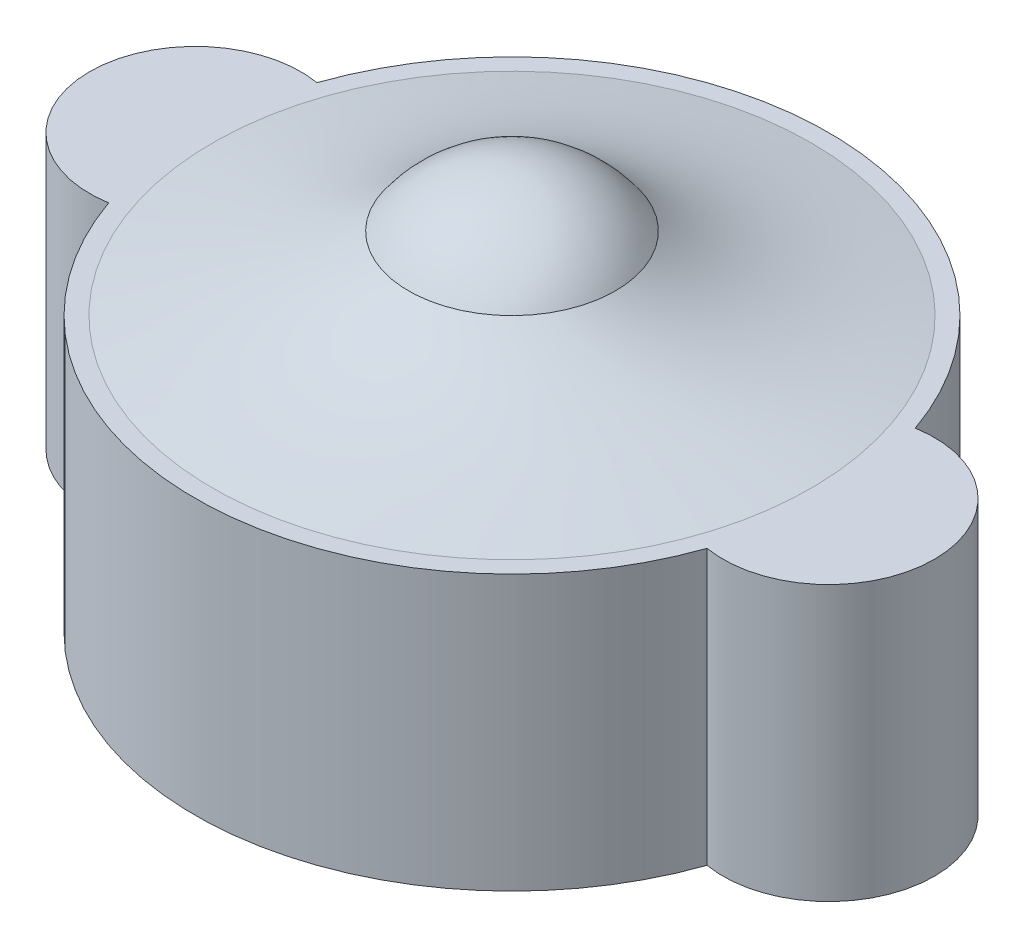
ISO-10303-21;
HEADER;
FILE_DESCRIPTION(('STEP AP214'),'2;1');
FILE_NAME('part.step','',(''),(''),'','','');
FILE_SCHEMA(('AUTOMOTIVE_DESIGN { 1 0 10303 214 1 1 1 1 }'));
ENDSEC;
DATA;
#1=APPLICATION_CONTEXT('core data for automotive mechanical design processes');
#2=APPLICATION_PROTOCOL_DEFINITION('international standard','automotive_design',2000,#1);
#3=PRODUCT_CONTEXT('',#1,'mechanical');
#4=PRODUCT('Part','Part','',(#3));
#5=PRODUCT_RELATED_PRODUCT_CATEGORY('part','',(#4));
#6=PRODUCT_DEFINITION_FORMATION('','',#4);
#7=PRODUCT_DEFINITION_CONTEXT('part definition',#1,'design');
#8=PRODUCT_DEFINITION('design','',#6,#7);
#9=PRODUCT_DEFINITION_SHAPE('','',#8);
#10=(LENGTH_UNIT() NAMED_UNIT(*) SI_UNIT(.MILLI.,.METRE.));
#11=(NAMED_UNIT(*) PLANE_ANGLE_UNIT() SI_UNIT($,.RADIAN.));
#12=(NAMED_UNIT(*) SI_UNIT($,.STERADIAN.) SOLID_ANGLE_UNIT());
#13=UNCERTAINTY_MEASURE_WITH_UNIT(LENGTH_MEASURE(1.E-05),#10,'distance_accuracy_value','');
#14=(GEOMETRIC_REPRESENTATION_CONTEXT(3) GLOBAL_UNCERTAINTY_ASSIGNED_CONTEXT((#13)) GLOBAL_UNIT_ASSIGNED_CONTEXT((#10,
#11,#12)) REPRESENTATION_CONTEXT('',''));
#15=CARTESIAN_POINT('',(0.,0.,0.));
#16=DIRECTION('',(0.,0.,1.));
#17=DIRECTION('',(1.,0.,0.));
#18=AXIS2_PLACEMENT_3D('',#15,#16,#17);
#19=CARTESIAN_POINT('',(0.,16.51,0.));
#20=DIRECTION('',(0.,-1.,0.));
#21=DIRECTION('',(0.,0.,-1.));
#22=AXIS2_PLACEMENT_3D('',#19,#20,#21);
#23=CYLINDRICAL_SURFACE('',#22,19.05);
#24=CARTESIAN_POINT('',(0.,0.,0.));
#25=DIRECTION('',(0.,1.,0.));
#26=DIRECTION('',(0.,0.,1.));
#27=AXIS2_PLACEMENT_3D('',#24,#25,#26);
#28=CIRCLE('',#27,19.05);
#29=CARTESIAN_POINT('',(-17.9916666666667,0.,6.26118443711376));
#30=VERTEX_POINT('',#29);
#31=CARTESIAN_POINT('',(17.9916666666667,0.,6.26118443711376));
#32=VERTEX_POINT('',#31);
#33=EDGE_CURVE('E110',#30,#32,#28,.T.);
#34=ORIENTED_EDGE('',*,*,#33,.T.);
#35=DIRECTION('',(0.,-1.,0.));
#36=VECTOR('',#35,1.);
#37=CARTESIAN_POINT('',(17.9916666666667,16.51,6.26118443711376));
#38=LINE('',#37,#36);
#39=CARTESIAN_POINT('',(17.9916666666667,16.51,6.26118443711376));
#40=VERTEX_POINT('',#39);
#41=EDGE_CURVE('E52',#40,#32,#38,.T.);
#42=ORIENTED_EDGE('',*,*,#41,.F.);
#43=CARTESIAN_POINT('',(0.,16.51,0.));
#44=DIRECTION('',(0.,1.,0.));
#45=DIRECTION('',(0.,0.,1.));
#46=AXIS2_PLACEMENT_3D('',#43,#44,#45);
#47=CIRCLE('',#46,19.05);
#48=CARTESIAN_POINT('',(-17.9916666666667,16.51,6.26118443711376));
#49=VERTEX_POINT('',#48);
#50=EDGE_CURVE('E96',#49,#40,#47,.T.);
#51=ORIENTED_EDGE('',*,*,#50,.F.);
#52=DIRECTION('',(0.,-1.,0.));
#53=VECTOR('',#52,1.);
#54=CARTESIAN_POINT('',(-17.9916666666667,16.51,6.26118443711376));
#55=LINE('',#54,#53);
#56=EDGE_CURVE('E105',#49,#30,#55,.T.);
#57=ORIENTED_EDGE('',*,*,#56,.T.);
#58=EDGE_LOOP('',(#34,#42,#51,#57));
#59=FACE_BOUND('',#58,.T.);
#60=ADVANCED_FACE('F42',(#59),#23,.T.);
#61=CARTESIAN_POINT('',(19.05,16.51,0.));
#62=DIRECTION('',(0.,-1.,0.));
#63=DIRECTION('',(0.,0.,-1.));
#64=AXIS2_PLACEMENT_3D('',#61,#62,#63);
#65=CYLINDRICAL_SURFACE('',#64,6.35);
#66=CARTESIAN_POINT('',(19.05,0.,0.));
#67=DIRECTION('',(0.,1.,0.));
#68=DIRECTION('',(0.,0.,1.));
#69=AXIS2_PLACEMENT_3D('',#66,#67,#68);
#70=CIRCLE('',#69,6.35);
#71=CARTESIAN_POINT('',(17.9916666666667,0.,-6.26118443711376));
#72=VERTEX_POINT('',#71);
#73=EDGE_CURVE('E100',#32,#72,#70,.T.);
#74=ORIENTED_EDGE('',*,*,#73,.T.);
#75=DIRECTION('',(0.,-1.,0.));
#76=VECTOR('',#75,1.);
#77=CARTESIAN_POINT('',(17.9916666666667,16.51,-6.26118443711376));
#78=LINE('',#77,#76);
#79=CARTESIAN_POINT('',(17.9916666666667,16.51,-6.26118443711376));
#80=VERTEX_POINT('',#79);
#81=EDGE_CURVE('E99',#80,#72,#78,.T.);
#82=ORIENTED_EDGE('',*,*,#81,.F.);
#83=CARTESIAN_POINT('',(19.05,16.51,0.));
#84=DIRECTION('',(0.,1.,0.));
#85=DIRECTION('',(0.,0.,1.));
#86=AXIS2_PLACEMENT_3D('',#83,#84,#85);
#87=CIRCLE('',#86,6.35);
#88=EDGE_CURVE('E91',#40,#80,#87,.T.);
#89=ORIENTED_EDGE('',*,*,#88,.F.);
#90=ORIENTED_EDGE('',*,*,#41,.T.);
#91=EDGE_LOOP('',(#74,#82,#89,#90));
#92=FACE_BOUND('',#91,.T.);
#93=ADVANCED_FACE('F44',(#92),#65,.T.);
#94=CARTESIAN_POINT('',(-17.9916666666667,0.,-6.26118443711376));
#95=VERTEX_POINT('',#94);
#96=EDGE_CURVE('E77',#72,#95,#28,.T.);
#97=ORIENTED_EDGE('',*,*,#96,.T.);
#98=DIRECTION('',(0.,-1.,0.));
#99=VECTOR('',#98,1.);
#100=CARTESIAN_POINT('',(-17.9916666666667,16.51,-6.26118443711376));
#101=LINE('',#100,#99);
#102=CARTESIAN_POINT('',(-17.9916666666667,16.51,-6.26118443711376));
#103=VERTEX_POINT('',#102);
#104=EDGE_CURVE('E101',#103,#95,#101,.T.);
#105=ORIENTED_EDGE('',*,*,#104,.F.);
#106=EDGE_CURVE('E94',#80,#103,#47,.T.);
#107=ORIENTED_EDGE('',*,*,#106,.F.);
#108=ORIENTED_EDGE('',*,*,#81,.T.);
#109=EDGE_LOOP('',(#97,#105,#107,#108));
#110=FACE_BOUND('',#109,.T.);
#111=ADVANCED_FACE('F103',(#110),#23,.T.);
#112=CARTESIAN_POINT('',(-19.05,16.51,0.));
#113=DIRECTION('',(0.,-1.,0.));
#114=DIRECTION('',(0.,0.,-1.));
#115=AXIS2_PLACEMENT_3D('',#112,#113,#114);
#116=CYLINDRICAL_SURFACE('',#115,6.35);
#117=CARTESIAN_POINT('',(-19.05,0.,0.));
#118=DIRECTION('',(0.,1.,0.));
#119=DIRECTION('',(0.,0.,1.));
#120=AXIS2_PLACEMENT_3D('',#117,#118,#119);
#121=CIRCLE('',#120,6.35);
#122=EDGE_CURVE('E83',#95,#30,#121,.T.);
#123=ORIENTED_EDGE('',*,*,#122,.T.);
#124=ORIENTED_EDGE('',*,*,#56,.F.);
#125=CARTESIAN_POINT('',(-19.05,16.51,0.));
#126=DIRECTION('',(0.,1.,0.));
#127=DIRECTION('',(0.,0.,1.));
#128=AXIS2_PLACEMENT_3D('',#125,#126,#127);
#129=CIRCLE('',#128,6.35);
#130=EDGE_CURVE('E60',#103,#49,#129,.T.);
#131=ORIENTED_EDGE('',*,*,#130,.F.);
#132=ORIENTED_EDGE('',*,*,#104,.T.);
#133=EDGE_LOOP('',(#123,#124,#131,#132));
#134=FACE_BOUND('',#133,.T.);
#135=ADVANCED_FACE('F151',(#134),#116,.T.);
#136=CARTESIAN_POINT('',(0.,16.51,0.));
#137=DIRECTION('',(0.,1.,0.));
#138=DIRECTION('',(0.,0.,1.));
#139=AXIS2_PLACEMENT_3D('',#136,#137,#138);
#140=PLANE('',#139);
#141=CARTESIAN_POINT('',(0.,16.51,0.));
#142=DIRECTION('',(0.,-1.,0.));
#143=DIRECTION('',(0.,0.,-1.));
#144=AXIS2_PLACEMENT_3D('',#141,#142,#143);
#145=CIRCLE('',#144,17.9916666666667);
#146=CARTESIAN_POINT('',(0.,16.51,-17.9916666666667));
#147=VERTEX_POINT('',#146);
#148=EDGE_CURVE('E11',#147,#147,#145,.F.);
#149=ORIENTED_EDGE('',*,*,#148,.F.);
#150=EDGE_LOOP('',(#149));
#151=FACE_BOUND('',#150,.T.);
#152=ORIENTED_EDGE('',*,*,#50,.T.);
#153=ORIENTED_EDGE('',*,*,#88,.T.);
#154=ORIENTED_EDGE('',*,*,#106,.T.);
#155=ORIENTED_EDGE('',*,*,#130,.T.);
#156=EDGE_LOOP('',(#152,#153,#154,#155));
#157=FACE_BOUND('',#156,.T.);
#158=ADVANCED_FACE('F92',(#151,#157),#140,.T.);
#159=CARTESIAN_POINT('',(0.,0.,0.));
#160=DIRECTION('',(0.,1.,0.));
#161=DIRECTION('',(0.,0.,1.));
#162=AXIS2_PLACEMENT_3D('',#159,#160,#161);
#163=PLANE('',#162);
#164=ORIENTED_EDGE('',*,*,#33,.F.);
#165=ORIENTED_EDGE('',*,*,#122,.F.);
#166=ORIENTED_EDGE('',*,*,#96,.F.);
#167=ORIENTED_EDGE('',*,*,#73,.F.);
#168=EDGE_LOOP('',(#164,#165,#166,#167));
#169=FACE_BOUND('',#168,.T.);
#170=ADVANCED_FACE('F140',(#169),#163,.F.);
#171=CARTESIAN_POINT('',(-17.9916666666667,16.51,0.));
#172=CARTESIAN_POINT('',(-13.9499221693765,17.4014774855964,0.));
#173=CARTESIAN_POINT('',(-9.5622500032515,18.2458282700182,0.));
#174=CARTESIAN_POINT('',(-6.22561687213964,20.9038701120231,0.));
#175=B_SPLINE_CURVE_WITH_KNOTS('',3,(#171,#172,#173,#174),.UNSPECIFIED.,.F.,.F.,(4,4),(0.,1.),.UNSPECIFIED.);
#176=CARTESIAN_POINT('',(0.,16.51,0.));
#177=DIRECTION('',(0.,-1.,0.));
#178=AXIS1_PLACEMENT('',#176,#177);
#179=SURFACE_OF_REVOLUTION('',#175,#178);
#180=CARTESIAN_POINT('',(0.,20.9038701120231,0.));
#181=DIRECTION('',(0.,-1.,0.));
#182=DIRECTION('',(0.,0.,-1.));
#183=AXIS2_PLACEMENT_3D('',#180,#181,#182);
#184=CIRCLE('',#183,6.22561687213964);
#185=CARTESIAN_POINT('',(0.,20.9038701120231,-6.22561687213964));
#186=VERTEX_POINT('',#185);
#187=EDGE_CURVE('E124',#186,#186,#184,.F.);
#188=ORIENTED_EDGE('',*,*,#187,.F.);
#189=EDGE_LOOP('',(#188));
#190=FACE_BOUND('',#189,.T.);
#191=ORIENTED_EDGE('',*,*,#148,.T.);
#192=EDGE_LOOP('',(#191));
#193=FACE_BOUND('',#192,.T.);
#194=ADVANCED_FACE('F135',(#190,#193),#179,.F.);
#195=CARTESIAN_POINT('',(0.,16.51,0.));
#196=DIRECTION('',(-1.,0.,0.));
#197=DIRECTION('',(0.,0.,1.));
#198=AXIS2_PLACEMENT_3D('',#195,#196,#197);
#199=SPHERICAL_SURFACE('',#198,7.62);
#200=CARTESIAN_POINT('',(0.,16.51,0.));
#201=DIRECTION('',(0.,-1.,0.));
#202=DIRECTION('',(0.,0.,-1.));
#203=AXIS2_PLACEMENT_3D('',#200,#201,#202);
#204=SPHERICAL_SURFACE('',#203,7.62);
#205=ORIENTED_EDGE('',*,*,#187,.T.);
#206=EDGE_LOOP('',(#205));
#207=FACE_BOUND('',#206,.T.);
#208=ADVANCED_FACE('F139',(#207),#204,.T.);
#209=CLOSED_SHELL('',(#60,#93,#111,#135,#158,#170,#194,#208));
#210=CARTESIAN_POINT('',(0.,16.51,0.));
#211=DIRECTION('',(0.,-1.,0.));
#212=DIRECTION('',(0.,0.,-1.));
#213=AXIS2_PLACEMENT_3D('',#210,#211,#212);
#214=SPHERICAL_SURFACE('',#213,7.62);
#215=CARTESIAN_POINT('',(0.,16.51,0.));
#216=DIRECTION('',(0.,-1.,0.));
#217=DIRECTION('',(0.,0.,-1.));
#218=AXIS2_PLACEMENT_3D('',#215,#216,#217);
#219=CIRCLE('',#218,7.62);
#220=CARTESIAN_POINT('',(0.,16.51,-7.62));
#221=VERTEX_POINT('',#220);
#222=EDGE_CURVE('E120',#221,#221,#219,.T.);
#223=ORIENTED_EDGE('',*,*,#222,.T.);
#224=EDGE_LOOP('',(#223));
#225=FACE_BOUND('',#224,.T.);
#226=ADVANCED_FACE('F147',(#225),#214,.T.);
#227=CARTESIAN_POINT('',(0.,16.51,0.));
#228=DIRECTION('',(-1.,0.,0.));
#229=DIRECTION('',(0.,0.,1.));
#230=AXIS2_PLACEMENT_3D('',#227,#228,#229);
#231=SPHERICAL_SURFACE('',#230,13.335);
#232=CARTESIAN_POINT('',(0.,16.51,0.));
#233=DIRECTION('',(0.,-1.,0.));
#234=DIRECTION('',(0.,0.,-1.));
#235=AXIS2_PLACEMENT_3D('',#232,#233,#234);
#236=SPHERICAL_SURFACE('',#235,13.335);
#237=CARTESIAN_POINT('',(0.,16.51,0.));
#238=DIRECTION('',(0.,-1.,0.));
#239=DIRECTION('',(0.,0.,-1.));
#240=AXIS2_PLACEMENT_3D('',#237,#238,#239);
#241=CIRCLE('',#240,13.335);
#242=CARTESIAN_POINT('',(0.,16.51,-13.335));
#243=VERTEX_POINT('',#242);
#244=EDGE_CURVE('E118',#243,#243,#241,.F.);
#245=ORIENTED_EDGE('',*,*,#244,.T.);
#246=EDGE_LOOP('',(#245));
#247=FACE_BOUND('',#246,.T.);
#248=ADVANCED_FACE('F144',(#247),#236,.F.);
#249=CARTESIAN_POINT('',(0.,16.51,0.));
#250=DIRECTION('',(0.,-1.,0.));
#251=DIRECTION('',(0.,0.,-1.));
#252=AXIS2_PLACEMENT_3D('',#249,#250,#251);
#253=PLANE('',#252);
#254=ORIENTED_EDGE('',*,*,#222,.F.);
#255=EDGE_LOOP('',(#254));
#256=FACE_BOUND('',#255,.T.);
#257=ORIENTED_EDGE('',*,*,#244,.F.);
#258=EDGE_LOOP('',(#257));
#259=FACE_BOUND('',#258,.T.);
#260=ADVANCED_FACE('F142',(#256,#259),#253,.T.);
#261=CLOSED_SHELL('',(#226,#248,#260));
#262=ORIENTED_CLOSED_SHELL('',*,#261,.T.);
#263=BREP_WITH_VOIDS('B2',#209,(#262));
#264=ADVANCED_BREP_SHAPE_REPRESENTATION('',(#18,#263),#14);
#265=SHAPE_DEFINITION_REPRESENTATION(#9,#264);
ENDSEC;
END-ISO-10303-21;
